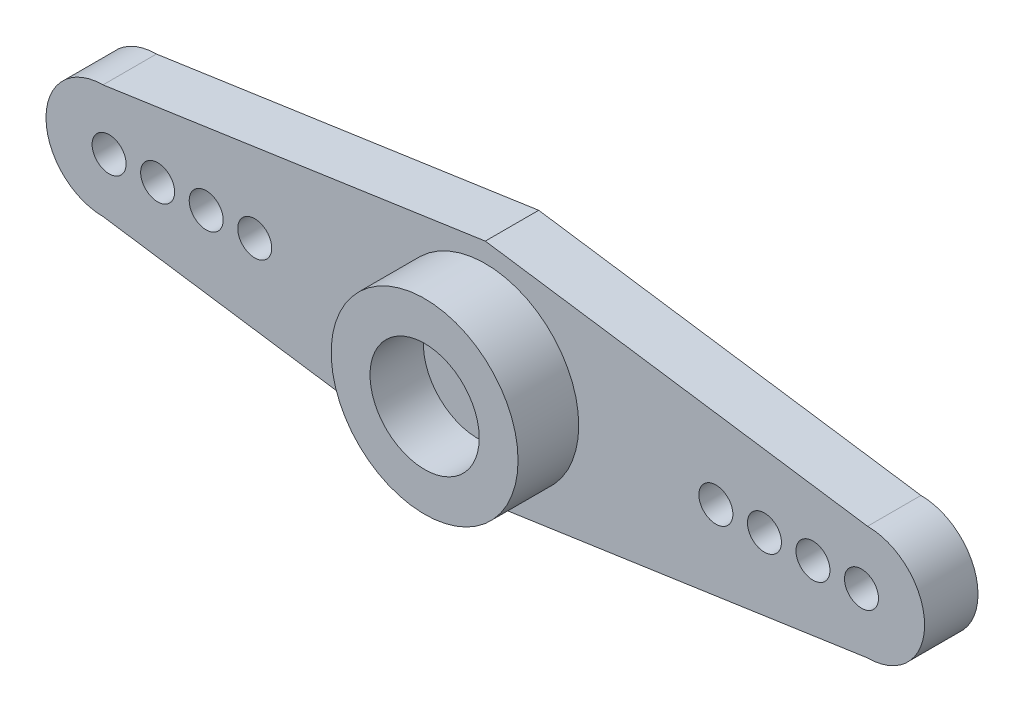
ISO-10303-21;
HEADER;
FILE_DESCRIPTION(('STEP AP214'),'2;1');
FILE_NAME('part.step','',(''),(''),'','','');
FILE_SCHEMA(('AUTOMOTIVE_DESIGN { 1 0 10303 214 1 1 1 1 }'));
ENDSEC;
DATA;
#1=APPLICATION_CONTEXT('core data for automotive mechanical design processes');
#2=APPLICATION_PROTOCOL_DEFINITION('international standard','automotive_design',2000,#1);
#3=PRODUCT_CONTEXT('',#1,'mechanical');
#4=PRODUCT('Part','Part','',(#3));
#5=PRODUCT_RELATED_PRODUCT_CATEGORY('part','',(#4));
#6=PRODUCT_DEFINITION_FORMATION('','',#4);
#7=PRODUCT_DEFINITION_CONTEXT('part definition',#1,'design');
#8=PRODUCT_DEFINITION('design','',#6,#7);
#9=PRODUCT_DEFINITION_SHAPE('','',#8);
#10=(LENGTH_UNIT() NAMED_UNIT(*) SI_UNIT(.MILLI.,.METRE.));
#11=(NAMED_UNIT(*) PLANE_ANGLE_UNIT() SI_UNIT($,.RADIAN.));
#12=(NAMED_UNIT(*) SI_UNIT($,.STERADIAN.) SOLID_ANGLE_UNIT());
#13=UNCERTAINTY_MEASURE_WITH_UNIT(LENGTH_MEASURE(1.E-05),#10,'distance_accuracy_value','');
#14=(GEOMETRIC_REPRESENTATION_CONTEXT(3) GLOBAL_UNCERTAINTY_ASSIGNED_CONTEXT((#13)) GLOBAL_UNIT_ASSIGNED_CONTEXT((#10,
#11,#12)) REPRESENTATION_CONTEXT('',''));
#15=CARTESIAN_POINT('',(0.,0.,0.));
#16=DIRECTION('',(0.,0.,1.));
#17=DIRECTION('',(1.,0.,0.));
#18=AXIS2_PLACEMENT_3D('',#15,#16,#17);
#19=CARTESIAN_POINT('',(22.987,5.9055,0.));
#20=DIRECTION('',(0.,0.,-1.));
#21=DIRECTION('',(-1.,0.,0.));
#22=AXIS2_PLACEMENT_3D('',#19,#20,#21);
#23=PLANE('',#22);
#24=CARTESIAN_POINT('',(-19.685,0.,0.));
#25=DIRECTION('',(0.,0.,-1.));
#26=DIRECTION('',(-1.,0.,0.));
#27=AXIS2_PLACEMENT_3D('',#24,#25,#26);
#28=CIRCLE('',#27,0.888999999999987);
#29=CARTESIAN_POINT('',(-20.574,0.,0.));
#30=VERTEX_POINT('',#29);
#31=EDGE_CURVE('E137',#30,#30,#28,.T.);
#32=ORIENTED_EDGE('',*,*,#31,.F.);
#33=EDGE_LOOP('',(#32));
#34=FACE_BOUND('',#33,.T.);
#35=CARTESIAN_POINT('',(-17.145,0.,0.));
#36=DIRECTION('',(0.,0.,-1.));
#37=DIRECTION('',(-1.,0.,0.));
#38=AXIS2_PLACEMENT_3D('',#35,#36,#37);
#39=CIRCLE('',#38,0.888999999999987);
#40=CARTESIAN_POINT('',(-18.034,0.,0.));
#41=VERTEX_POINT('',#40);
#42=EDGE_CURVE('E141',#41,#41,#39,.T.);
#43=ORIENTED_EDGE('',*,*,#42,.F.);
#44=EDGE_LOOP('',(#43));
#45=FACE_BOUND('',#44,.T.);
#46=CARTESIAN_POINT('',(-14.605,0.,0.));
#47=DIRECTION('',(0.,0.,-1.));
#48=DIRECTION('',(-1.,0.,0.));
#49=AXIS2_PLACEMENT_3D('',#46,#47,#48);
#50=CIRCLE('',#49,0.888999999999989);
#51=CARTESIAN_POINT('',(-15.494,0.,0.));
#52=VERTEX_POINT('',#51);
#53=EDGE_CURVE('E145',#52,#52,#50,.T.);
#54=ORIENTED_EDGE('',*,*,#53,.F.);
#55=EDGE_LOOP('',(#54));
#56=FACE_BOUND('',#55,.T.);
#57=CARTESIAN_POINT('',(-12.065,0.,0.));
#58=DIRECTION('',(0.,0.,-1.));
#59=DIRECTION('',(-1.,0.,0.));
#60=AXIS2_PLACEMENT_3D('',#57,#58,#59);
#61=CIRCLE('',#60,0.888999999999989);
#62=CARTESIAN_POINT('',(-12.954,0.,0.));
#63=VERTEX_POINT('',#62);
#64=EDGE_CURVE('E149',#63,#63,#61,.T.);
#65=ORIENTED_EDGE('',*,*,#64,.F.);
#66=EDGE_LOOP('',(#65));
#67=FACE_BOUND('',#66,.T.);
#68=CARTESIAN_POINT('',(19.685,0.,0.));
#69=DIRECTION('',(0.,0.,-1.));
#70=DIRECTION('',(-1.,0.,0.));
#71=AXIS2_PLACEMENT_3D('',#68,#69,#70);
#72=CIRCLE('',#71,0.888999999999987);
#73=CARTESIAN_POINT('',(18.796,0.,0.));
#74=VERTEX_POINT('',#73);
#75=EDGE_CURVE('E153',#74,#74,#72,.T.);
#76=ORIENTED_EDGE('',*,*,#75,.F.);
#77=EDGE_LOOP('',(#76));
#78=FACE_BOUND('',#77,.T.);
#79=CARTESIAN_POINT('',(17.145,0.,0.));
#80=DIRECTION('',(0.,0.,-1.));
#81=DIRECTION('',(-1.,0.,0.));
#82=AXIS2_PLACEMENT_3D('',#79,#80,#81);
#83=CIRCLE('',#82,0.888999999999987);
#84=CARTESIAN_POINT('',(16.256,0.,0.));
#85=VERTEX_POINT('',#84);
#86=EDGE_CURVE('E158',#85,#85,#83,.T.);
#87=ORIENTED_EDGE('',*,*,#86,.F.);
#88=EDGE_LOOP('',(#87));
#89=FACE_BOUND('',#88,.T.);
#90=CARTESIAN_POINT('',(14.605,0.,0.));
#91=DIRECTION('',(0.,0.,-1.));
#92=DIRECTION('',(-1.,0.,0.));
#93=AXIS2_PLACEMENT_3D('',#90,#91,#92);
#94=CIRCLE('',#93,0.888999999999989);
#95=CARTESIAN_POINT('',(13.716,0.,0.));
#96=VERTEX_POINT('',#95);
#97=EDGE_CURVE('E163',#96,#96,#94,.T.);
#98=ORIENTED_EDGE('',*,*,#97,.F.);
#99=EDGE_LOOP('',(#98));
#100=FACE_BOUND('',#99,.T.);
#101=CARTESIAN_POINT('',(12.065,0.,0.));
#102=DIRECTION('',(0.,0.,-1.));
#103=DIRECTION('',(-1.,0.,0.));
#104=AXIS2_PLACEMENT_3D('',#101,#102,#103);
#105=CIRCLE('',#104,0.888999999999989);
#106=CARTESIAN_POINT('',(11.176,0.,0.));
#107=VERTEX_POINT('',#106);
#108=EDGE_CURVE('E168',#107,#107,#105,.T.);
#109=ORIENTED_EDGE('',*,*,#108,.F.);
#110=EDGE_LOOP('',(#109));
#111=FACE_BOUND('',#110,.T.);
#112=CARTESIAN_POINT('',(20.0025,0.,0.));
#113=DIRECTION('',(0.,0.,1.));
#114=DIRECTION('',(-1.,0.,0.));
#115=AXIS2_PLACEMENT_3D('',#112,#113,#114);
#116=CIRCLE('',#115,2.9845);
#117=CARTESIAN_POINT('',(20.0025,-2.9845,0.));
#118=VERTEX_POINT('',#117);
#119=CARTESIAN_POINT('',(20.0025,2.9845,0.));
#120=VERTEX_POINT('',#119);
#121=EDGE_CURVE('E59',#118,#120,#116,.T.);
#122=ORIENTED_EDGE('',*,*,#121,.F.);
#123=DIRECTION('',(0.9895049271173,0.144499132213955,0.));
#124=VECTOR('',#123,1.);
#125=CARTESIAN_POINT('',(20.0025,-2.9845,0.));
#126=LINE('',#125,#124);
#127=CARTESIAN_POINT('',(-1.48999871685609E-13,-5.90549999999999,0.));
#128=VERTEX_POINT('',#127);
#129=EDGE_CURVE('E118',#128,#118,#126,.T.);
#130=ORIENTED_EDGE('',*,*,#129,.F.);
#131=DIRECTION('',(-0.9895049271173,0.144499132213955,0.));
#132=VECTOR('',#131,1.);
#133=CARTESIAN_POINT('',(-20.0025,-2.9845,0.));
#134=LINE('',#133,#132);
#135=CARTESIAN_POINT('',(-20.0025,-2.9845,0.));
#136=VERTEX_POINT('',#135);
#137=EDGE_CURVE('E131',#128,#136,#134,.T.);
#138=ORIENTED_EDGE('',*,*,#137,.T.);
#139=CARTESIAN_POINT('',(-20.0025,0.,0.));
#140=DIRECTION('',(0.,0.,-1.));
#141=DIRECTION('',(1.,0.,0.));
#142=AXIS2_PLACEMENT_3D('',#139,#140,#141);
#143=CIRCLE('',#142,2.9845);
#144=CARTESIAN_POINT('',(-20.0025,2.9845,0.));
#145=VERTEX_POINT('',#144);
#146=EDGE_CURVE('E126',#136,#145,#143,.T.);
#147=ORIENTED_EDGE('',*,*,#146,.T.);
#148=DIRECTION('',(0.9895049271173,0.144499132213955,0.));
#149=VECTOR('',#148,1.);
#150=CARTESIAN_POINT('',(-20.0025,2.9845,0.));
#151=LINE('',#150,#149);
#152=CARTESIAN_POINT('',(0.,5.90549999999999,0.));
#153=VERTEX_POINT('',#152);
#154=EDGE_CURVE('E123',#145,#153,#151,.T.);
#155=ORIENTED_EDGE('',*,*,#154,.T.);
#156=DIRECTION('',(-0.9895049271173,0.144499132213955,0.));
#157=VECTOR('',#156,1.);
#158=CARTESIAN_POINT('',(20.0025,2.9845,0.));
#159=LINE('',#158,#157);
#160=EDGE_CURVE('E121',#120,#153,#159,.T.);
#161=ORIENTED_EDGE('',*,*,#160,.F.);
#162=EDGE_LOOP('',(#122,#130,#138,#147,#155,#161));
#163=FACE_BOUND('',#162,.T.);
#164=ADVANCED_FACE('F42',(#34,#45,#56,#67,#78,#89,#100,#111,#163),#23,.T.);
#165=CARTESIAN_POINT('',(0.,0.,2.794));
#166=DIRECTION('',(0.,0.,1.));
#167=DIRECTION('',(1.,0.,0.));
#168=AXIS2_PLACEMENT_3D('',#165,#166,#167);
#169=PLANE('',#168);
#170=CARTESIAN_POINT('',(-19.685,0.,2.794));
#171=DIRECTION('',(0.,0.,1.));
#172=DIRECTION('',(1.,0.,0.));
#173=AXIS2_PLACEMENT_3D('',#170,#171,#172);
#174=CIRCLE('',#173,0.888999999999987);
#175=CARTESIAN_POINT('',(-18.796,0.,2.794));
#176=VERTEX_POINT('',#175);
#177=EDGE_CURVE('E140',#176,#176,#174,.T.);
#178=ORIENTED_EDGE('',*,*,#177,.F.);
#179=EDGE_LOOP('',(#178));
#180=FACE_BOUND('',#179,.T.);
#181=CARTESIAN_POINT('',(-17.145,0.,2.794));
#182=DIRECTION('',(0.,0.,1.));
#183=DIRECTION('',(1.,0.,0.));
#184=AXIS2_PLACEMENT_3D('',#181,#182,#183);
#185=CIRCLE('',#184,0.888999999999987);
#186=CARTESIAN_POINT('',(-16.256,0.,2.794));
#187=VERTEX_POINT('',#186);
#188=EDGE_CURVE('E144',#187,#187,#185,.T.);
#189=ORIENTED_EDGE('',*,*,#188,.F.);
#190=EDGE_LOOP('',(#189));
#191=FACE_BOUND('',#190,.T.);
#192=CARTESIAN_POINT('',(-14.605,0.,2.794));
#193=DIRECTION('',(0.,0.,1.));
#194=DIRECTION('',(1.,0.,0.));
#195=AXIS2_PLACEMENT_3D('',#192,#193,#194);
#196=CIRCLE('',#195,0.888999999999988);
#197=CARTESIAN_POINT('',(-13.716,0.,2.794));
#198=VERTEX_POINT('',#197);
#199=EDGE_CURVE('E148',#198,#198,#196,.T.);
#200=ORIENTED_EDGE('',*,*,#199,.F.);
#201=EDGE_LOOP('',(#200));
#202=FACE_BOUND('',#201,.T.);
#203=CARTESIAN_POINT('',(-12.065,0.,2.794));
#204=DIRECTION('',(0.,0.,1.));
#205=DIRECTION('',(1.,0.,0.));
#206=AXIS2_PLACEMENT_3D('',#203,#204,#205);
#207=CIRCLE('',#206,0.888999999999988);
#208=CARTESIAN_POINT('',(-11.176,0.,2.794));
#209=VERTEX_POINT('',#208);
#210=EDGE_CURVE('E152',#209,#209,#207,.T.);
#211=ORIENTED_EDGE('',*,*,#210,.F.);
#212=EDGE_LOOP('',(#211));
#213=FACE_BOUND('',#212,.T.);
#214=CARTESIAN_POINT('',(19.685,0.,2.794));
#215=DIRECTION('',(0.,0.,1.));
#216=DIRECTION('',(1.,0.,0.));
#217=AXIS2_PLACEMENT_3D('',#214,#215,#216);
#218=CIRCLE('',#217,0.888999999999987);
#219=CARTESIAN_POINT('',(20.574,0.,2.794));
#220=VERTEX_POINT('',#219);
#221=EDGE_CURVE('E157',#220,#220,#218,.T.);
#222=ORIENTED_EDGE('',*,*,#221,.F.);
#223=EDGE_LOOP('',(#222));
#224=FACE_BOUND('',#223,.T.);
#225=CARTESIAN_POINT('',(17.145,0.,2.794));
#226=DIRECTION('',(0.,0.,1.));
#227=DIRECTION('',(1.,0.,0.));
#228=AXIS2_PLACEMENT_3D('',#225,#226,#227);
#229=CIRCLE('',#228,0.888999999999987);
#230=CARTESIAN_POINT('',(18.034,0.,2.794));
#231=VERTEX_POINT('',#230);
#232=EDGE_CURVE('E162',#231,#231,#229,.T.);
#233=ORIENTED_EDGE('',*,*,#232,.F.);
#234=EDGE_LOOP('',(#233));
#235=FACE_BOUND('',#234,.T.);
#236=CARTESIAN_POINT('',(14.605,0.,2.794));
#237=DIRECTION('',(0.,0.,1.));
#238=DIRECTION('',(1.,0.,0.));
#239=AXIS2_PLACEMENT_3D('',#236,#237,#238);
#240=CIRCLE('',#239,0.888999999999988);
#241=CARTESIAN_POINT('',(15.494,0.,2.794));
#242=VERTEX_POINT('',#241);
#243=EDGE_CURVE('E167',#242,#242,#240,.T.);
#244=ORIENTED_EDGE('',*,*,#243,.F.);
#245=EDGE_LOOP('',(#244));
#246=FACE_BOUND('',#245,.T.);
#247=CARTESIAN_POINT('',(12.065,0.,2.794));
#248=DIRECTION('',(0.,0.,1.));
#249=DIRECTION('',(1.,0.,0.));
#250=AXIS2_PLACEMENT_3D('',#247,#248,#249);
#251=CIRCLE('',#250,0.888999999999988);
#252=CARTESIAN_POINT('',(12.954,0.,2.794));
#253=VERTEX_POINT('',#252);
#254=EDGE_CURVE('E172',#253,#253,#251,.T.);
#255=ORIENTED_EDGE('',*,*,#254,.F.);
#256=EDGE_LOOP('',(#255));
#257=FACE_BOUND('',#256,.T.);
#258=CARTESIAN_POINT('',(0.,0.,2.794));
#259=DIRECTION('',(0.,0.,1.));
#260=DIRECTION('',(1.,0.,0.));
#261=AXIS2_PLACEMENT_3D('',#258,#259,#260);
#262=CIRCLE('',#261,4.8895);
#263=CARTESIAN_POINT('',(4.8895,0.,2.794));
#264=VERTEX_POINT('',#263);
#265=EDGE_CURVE('E108',#264,#264,#262,.T.);
#266=ORIENTED_EDGE('',*,*,#265,.F.);
#267=EDGE_LOOP('',(#266));
#268=FACE_BOUND('',#267,.T.);
#269=DIRECTION('',(-0.9895049271173,0.144499132213955,0.));
#270=VECTOR('',#269,1.);
#271=CARTESIAN_POINT('',(-0.844383763728395,-5.78219316466189,2.794));
#272=LINE('',#271,#270);
#273=CARTESIAN_POINT('',(-1.52993049696762E-13,-5.90549999999999,2.794));
#274=VERTEX_POINT('',#273);
#275=CARTESIAN_POINT('',(-20.0025,-2.9845,2.794));
#276=VERTEX_POINT('',#275);
#277=EDGE_CURVE('E50',#274,#276,#272,.T.);
#278=ORIENTED_EDGE('',*,*,#277,.F.);
#279=DIRECTION('',(0.9895049271173,0.144499132213955,0.));
#280=VECTOR('',#279,1.);
#281=CARTESIAN_POINT('',(0.844383763728409,-5.78219316466188,2.794));
#282=LINE('',#281,#280);
#283=CARTESIAN_POINT('',(20.0025,-2.9845,2.794));
#284=VERTEX_POINT('',#283);
#285=EDGE_CURVE('E117',#274,#284,#282,.T.);
#286=ORIENTED_EDGE('',*,*,#285,.T.);
#287=CARTESIAN_POINT('',(20.0025,0.,2.794));
#288=DIRECTION('',(0.,0.,1.));
#289=DIRECTION('',(1.,0.,0.));
#290=AXIS2_PLACEMENT_3D('',#287,#288,#289);
#291=CIRCLE('',#290,2.9845);
#292=CARTESIAN_POINT('',(20.0025,2.9845,2.794));
#293=VERTEX_POINT('',#292);
#294=EDGE_CURVE('E12',#284,#293,#291,.T.);
#295=ORIENTED_EDGE('',*,*,#294,.T.);
#296=DIRECTION('',(-0.9895049271173,0.144499132213955,0.));
#297=VECTOR('',#296,1.);
#298=CARTESIAN_POINT('',(0.844383763728408,5.78219316466188,2.794));
#299=LINE('',#298,#297);
#300=CARTESIAN_POINT('',(0.,5.9055,2.794));
#301=VERTEX_POINT('',#300);
#302=EDGE_CURVE('E111',#293,#301,#299,.T.);
#303=ORIENTED_EDGE('',*,*,#302,.T.);
#304=DIRECTION('',(0.9895049271173,0.144499132213955,0.));
#305=VECTOR('',#304,1.);
#306=CARTESIAN_POINT('',(-0.844383763728395,5.78219316466188,2.794));
#307=LINE('',#306,#305);
#308=CARTESIAN_POINT('',(-20.0025,2.9845,2.794));
#309=VERTEX_POINT('',#308);
#310=EDGE_CURVE('E96',#309,#301,#307,.T.);
#311=ORIENTED_EDGE('',*,*,#310,.F.);
#312=CARTESIAN_POINT('',(-20.0025,0.,2.794));
#313=DIRECTION('',(0.,0.,1.));
#314=DIRECTION('',(1.,0.,0.));
#315=AXIS2_PLACEMENT_3D('',#312,#313,#314);
#316=CIRCLE('',#315,2.9845);
#317=EDGE_CURVE('E107',#276,#309,#316,.F.);
#318=ORIENTED_EDGE('',*,*,#317,.F.);
#319=EDGE_LOOP('',(#278,#286,#295,#303,#311,#318));
#320=FACE_BOUND('',#319,.T.);
#321=ADVANCED_FACE('F112',(#180,#191,#202,#213,#224,#235,#246,#257,#268,#320),#169,.T.);
#322=CARTESIAN_POINT('',(0.,0.,2.794));
#323=DIRECTION('',(0.,0.,1.));
#324=DIRECTION('',(1.,0.,0.));
#325=AXIS2_PLACEMENT_3D('',#322,#323,#324);
#326=CYLINDRICAL_SURFACE('',#325,4.8895);
#327=ORIENTED_EDGE('',*,*,#265,.T.);
#328=EDGE_LOOP('',(#327));
#329=FACE_BOUND('',#328,.T.);
#330=CARTESIAN_POINT('',(0.,0.,5.969));
#331=DIRECTION('',(0.,0.,1.));
#332=DIRECTION('',(1.,0.,0.));
#333=AXIS2_PLACEMENT_3D('',#330,#331,#332);
#334=CIRCLE('',#333,4.8895);
#335=CARTESIAN_POINT('',(4.8895,0.,5.969));
#336=VERTEX_POINT('',#335);
#337=EDGE_CURVE('E176',#336,#336,#334,.T.);
#338=ORIENTED_EDGE('',*,*,#337,.F.);
#339=EDGE_LOOP('',(#338));
#340=FACE_BOUND('',#339,.T.);
#341=ADVANCED_FACE('F237',(#329,#340),#326,.T.);
#342=CARTESIAN_POINT('',(22.987,5.9055,5.969));
#343=DIRECTION('',(0.,0.,-1.));
#344=DIRECTION('',(-1.,0.,0.));
#345=AXIS2_PLACEMENT_3D('',#342,#343,#344);
#346=PLANE('',#345);
#347=CARTESIAN_POINT('',(0.,0.,5.969));
#348=DIRECTION('',(0.,0.,1.));
#349=DIRECTION('',(1.,0.,0.));
#350=AXIS2_PLACEMENT_3D('',#347,#348,#349);
#351=CIRCLE('',#350,2.8575);
#352=CARTESIAN_POINT('',(2.8575,0.,5.969));
#353=VERTEX_POINT('',#352);
#354=EDGE_CURVE('E177',#353,#353,#351,.T.);
#355=ORIENTED_EDGE('',*,*,#354,.F.);
#356=EDGE_LOOP('',(#355));
#357=FACE_BOUND('',#356,.T.);
#358=ORIENTED_EDGE('',*,*,#337,.T.);
#359=EDGE_LOOP('',(#358));
#360=FACE_BOUND('',#359,.T.);
#361=ADVANCED_FACE('F276',(#357,#360),#346,.F.);
#362=CARTESIAN_POINT('',(0.,0.,3.175));
#363=DIRECTION('',(0.,0.,1.));
#364=DIRECTION('',(1.,0.,0.));
#365=AXIS2_PLACEMENT_3D('',#362,#363,#364);
#366=CYLINDRICAL_SURFACE('',#365,2.8575);
#367=CARTESIAN_POINT('',(0.,0.,3.175));
#368=DIRECTION('',(0.,0.,1.));
#369=DIRECTION('',(1.,0.,0.));
#370=AXIS2_PLACEMENT_3D('',#367,#368,#369);
#371=CIRCLE('',#370,2.8575);
#372=CARTESIAN_POINT('',(2.8575,0.,3.175));
#373=VERTEX_POINT('',#372);
#374=EDGE_CURVE('E173',#373,#373,#371,.T.);
#375=ORIENTED_EDGE('',*,*,#374,.F.);
#376=EDGE_LOOP('',(#375));
#377=FACE_BOUND('',#376,.T.);
#378=ORIENTED_EDGE('',*,*,#354,.T.);
#379=EDGE_LOOP('',(#378));
#380=FACE_BOUND('',#379,.T.);
#381=ADVANCED_FACE('F269',(#377,#380),#366,.F.);
#382=CARTESIAN_POINT('',(0.,0.,3.175));
#383=DIRECTION('',(0.,0.,1.));
#384=DIRECTION('',(1.,0.,0.));
#385=AXIS2_PLACEMENT_3D('',#382,#383,#384);
#386=PLANE('',#385);
#387=ORIENTED_EDGE('',*,*,#374,.T.);
#388=EDGE_LOOP('',(#387));
#389=FACE_BOUND('',#388,.T.);
#390=ADVANCED_FACE('F259',(#389),#386,.T.);
#391=CARTESIAN_POINT('',(12.065,0.,0.));
#392=DIRECTION('',(0.,0.,-1.));
#393=DIRECTION('',(-1.,0.,0.));
#394=AXIS2_PLACEMENT_3D('',#391,#392,#393);
#395=CYLINDRICAL_SURFACE('',#394,0.888999999999988);
#396=ORIENTED_EDGE('',*,*,#254,.T.);
#397=EDGE_LOOP('',(#396));
#398=FACE_BOUND('',#397,.T.);
#399=ORIENTED_EDGE('',*,*,#108,.T.);
#400=EDGE_LOOP('',(#399));
#401=FACE_BOUND('',#400,.T.);
#402=ADVANCED_FACE('F256',(#398,#401),#395,.F.);
#403=CARTESIAN_POINT('',(14.605,0.,0.));
#404=DIRECTION('',(0.,0.,-1.));
#405=DIRECTION('',(-1.,0.,0.));
#406=AXIS2_PLACEMENT_3D('',#403,#404,#405);
#407=CYLINDRICAL_SURFACE('',#406,0.888999999999988);
#408=ORIENTED_EDGE('',*,*,#243,.T.);
#409=EDGE_LOOP('',(#408));
#410=FACE_BOUND('',#409,.T.);
#411=ORIENTED_EDGE('',*,*,#97,.T.);
#412=EDGE_LOOP('',(#411));
#413=FACE_BOUND('',#412,.T.);
#414=ADVANCED_FACE('F258',(#410,#413),#407,.F.);
#415=CARTESIAN_POINT('',(17.145,0.,0.));
#416=DIRECTION('',(0.,0.,-1.));
#417=DIRECTION('',(-1.,0.,0.));
#418=AXIS2_PLACEMENT_3D('',#415,#416,#417);
#419=CYLINDRICAL_SURFACE('',#418,0.888999999999987);
#420=ORIENTED_EDGE('',*,*,#232,.T.);
#421=EDGE_LOOP('',(#420));
#422=FACE_BOUND('',#421,.T.);
#423=ORIENTED_EDGE('',*,*,#86,.T.);
#424=EDGE_LOOP('',(#423));
#425=FACE_BOUND('',#424,.T.);
#426=ADVANCED_FACE('F266',(#422,#425),#419,.F.);
#427=CARTESIAN_POINT('',(19.685,0.,0.));
#428=DIRECTION('',(0.,0.,-1.));
#429=DIRECTION('',(-1.,0.,0.));
#430=AXIS2_PLACEMENT_3D('',#427,#428,#429);
#431=CYLINDRICAL_SURFACE('',#430,0.888999999999987);
#432=ORIENTED_EDGE('',*,*,#221,.T.);
#433=EDGE_LOOP('',(#432));
#434=FACE_BOUND('',#433,.T.);
#435=ORIENTED_EDGE('',*,*,#75,.T.);
#436=EDGE_LOOP('',(#435));
#437=FACE_BOUND('',#436,.T.);
#438=ADVANCED_FACE('F318',(#434,#437),#431,.F.);
#439=CARTESIAN_POINT('',(-12.065,0.,0.));
#440=DIRECTION('',(0.,0.,-1.));
#441=DIRECTION('',(-1.,0.,0.));
#442=AXIS2_PLACEMENT_3D('',#439,#440,#441);
#443=CYLINDRICAL_SURFACE('',#442,0.888999999999988);
#444=ORIENTED_EDGE('',*,*,#210,.T.);
#445=EDGE_LOOP('',(#444));
#446=FACE_BOUND('',#445,.T.);
#447=ORIENTED_EDGE('',*,*,#64,.T.);
#448=EDGE_LOOP('',(#447));
#449=FACE_BOUND('',#448,.T.);
#450=ADVANCED_FACE('F327',(#446,#449),#443,.F.);
#451=CARTESIAN_POINT('',(-14.605,0.,0.));
#452=DIRECTION('',(0.,0.,-1.));
#453=DIRECTION('',(-1.,0.,0.));
#454=AXIS2_PLACEMENT_3D('',#451,#452,#453);
#455=CYLINDRICAL_SURFACE('',#454,0.888999999999988);
#456=ORIENTED_EDGE('',*,*,#199,.T.);
#457=EDGE_LOOP('',(#456));
#458=FACE_BOUND('',#457,.T.);
#459=ORIENTED_EDGE('',*,*,#53,.T.);
#460=EDGE_LOOP('',(#459));
#461=FACE_BOUND('',#460,.T.);
#462=ADVANCED_FACE('F337',(#458,#461),#455,.F.);
#463=CARTESIAN_POINT('',(-17.145,0.,0.));
#464=DIRECTION('',(0.,0.,-1.));
#465=DIRECTION('',(-1.,0.,0.));
#466=AXIS2_PLACEMENT_3D('',#463,#464,#465);
#467=CYLINDRICAL_SURFACE('',#466,0.888999999999987);
#468=ORIENTED_EDGE('',*,*,#188,.T.);
#469=EDGE_LOOP('',(#468));
#470=FACE_BOUND('',#469,.T.);
#471=ORIENTED_EDGE('',*,*,#42,.T.);
#472=EDGE_LOOP('',(#471));
#473=FACE_BOUND('',#472,.T.);
#474=ADVANCED_FACE('F347',(#470,#473),#467,.F.);
#475=CARTESIAN_POINT('',(-19.685,0.,0.));
#476=DIRECTION('',(0.,0.,-1.));
#477=DIRECTION('',(-1.,0.,0.));
#478=AXIS2_PLACEMENT_3D('',#475,#476,#477);
#479=CYLINDRICAL_SURFACE('',#478,0.888999999999987);
#480=ORIENTED_EDGE('',*,*,#177,.T.);
#481=EDGE_LOOP('',(#480));
#482=FACE_BOUND('',#481,.T.);
#483=ORIENTED_EDGE('',*,*,#31,.T.);
#484=EDGE_LOOP('',(#483));
#485=FACE_BOUND('',#484,.T.);
#486=ADVANCED_FACE('F357',(#482,#485),#479,.F.);
#487=CARTESIAN_POINT('',(-20.0025,-2.9845,0.));
#488=DIRECTION('',(0.144499132213955,0.9895049271173,0.));
#489=DIRECTION('',(-0.9895049271173,0.144499132213955,0.));
#490=AXIS2_PLACEMENT_3D('',#487,#488,#489);
#491=PLANE('',#490);
#492=DIRECTION('',(0.,0.,1.));
#493=VECTOR('',#492,1.);
#494=CARTESIAN_POINT('',(0.,-5.9055,0.));
#495=LINE('',#494,#493);
#496=EDGE_CURVE('E134',#128,#274,#495,.T.);
#497=ORIENTED_EDGE('',*,*,#496,.T.);
#498=ORIENTED_EDGE('',*,*,#277,.T.);
#499=DIRECTION('',(0.,0.,1.));
#500=VECTOR('',#499,1.);
#501=CARTESIAN_POINT('',(-20.0025,-2.9845,0.));
#502=LINE('',#501,#500);
#503=EDGE_CURVE('E122',#136,#276,#502,.T.);
#504=ORIENTED_EDGE('',*,*,#503,.F.);
#505=ORIENTED_EDGE('',*,*,#137,.F.);
#506=EDGE_LOOP('',(#497,#498,#504,#505));
#507=FACE_BOUND('',#506,.T.);
#508=ADVANCED_FACE('F207',(#507),#491,.F.);
#509=CARTESIAN_POINT('',(-20.0025,0.,0.));
#510=DIRECTION('',(0.,0.,1.));
#511=DIRECTION('',(1.,0.,0.));
#512=AXIS2_PLACEMENT_3D('',#509,#510,#511);
#513=CYLINDRICAL_SURFACE('',#512,2.9845);
#514=ORIENTED_EDGE('',*,*,#503,.T.);
#515=ORIENTED_EDGE('',*,*,#317,.T.);
#516=DIRECTION('',(0.,0.,1.));
#517=VECTOR('',#516,1.);
#518=CARTESIAN_POINT('',(-20.0025,2.9845,0.));
#519=LINE('',#518,#517);
#520=EDGE_CURVE('E104',#145,#309,#519,.T.);
#521=ORIENTED_EDGE('',*,*,#520,.F.);
#522=ORIENTED_EDGE('',*,*,#146,.F.);
#523=EDGE_LOOP('',(#514,#515,#521,#522));
#524=FACE_BOUND('',#523,.T.);
#525=ADVANCED_FACE('F213',(#524),#513,.T.);
#526=CARTESIAN_POINT('',(-20.0025,2.9845,0.));
#527=DIRECTION('',(0.144499132213955,-0.9895049271173,0.));
#528=DIRECTION('',(0.9895049271173,0.144499132213955,0.));
#529=AXIS2_PLACEMENT_3D('',#526,#527,#528);
#530=PLANE('',#529);
#531=ORIENTED_EDGE('',*,*,#520,.T.);
#532=ORIENTED_EDGE('',*,*,#310,.T.);
#533=DIRECTION('',(0.,0.,1.));
#534=VECTOR('',#533,1.);
#535=CARTESIAN_POINT('',(0.,5.9055,0.));
#536=LINE('',#535,#534);
#537=EDGE_CURVE('E101',#153,#301,#536,.T.);
#538=ORIENTED_EDGE('',*,*,#537,.F.);
#539=ORIENTED_EDGE('',*,*,#154,.F.);
#540=EDGE_LOOP('',(#531,#532,#538,#539));
#541=FACE_BOUND('',#540,.T.);
#542=ADVANCED_FACE('F98',(#541),#530,.F.);
#543=CARTESIAN_POINT('',(20.0025,-2.9845,0.));
#544=DIRECTION('',(0.144499132213955,-0.9895049271173,0.));
#545=DIRECTION('',(0.9895049271173,0.144499132213955,0.));
#546=AXIS2_PLACEMENT_3D('',#543,#544,#545);
#547=PLANE('',#546);
#548=ORIENTED_EDGE('',*,*,#285,.F.);
#549=ORIENTED_EDGE('',*,*,#496,.F.);
#550=ORIENTED_EDGE('',*,*,#129,.T.);
#551=DIRECTION('',(0.,0.,1.));
#552=VECTOR('',#551,1.);
#553=CARTESIAN_POINT('',(20.0025,-2.9845,0.));
#554=LINE('',#553,#552);
#555=EDGE_CURVE('E217',#118,#284,#554,.T.);
#556=ORIENTED_EDGE('',*,*,#555,.T.);
#557=EDGE_LOOP('',(#548,#549,#550,#556));
#558=FACE_BOUND('',#557,.T.);
#559=ADVANCED_FACE('F231',(#558),#547,.T.);
#560=CARTESIAN_POINT('',(20.0025,0.,0.));
#561=DIRECTION('',(0.,0.,1.));
#562=DIRECTION('',(1.,0.,0.));
#563=AXIS2_PLACEMENT_3D('',#560,#561,#562);
#564=CYLINDRICAL_SURFACE('',#563,2.9845);
#565=ORIENTED_EDGE('',*,*,#294,.F.);
#566=ORIENTED_EDGE('',*,*,#555,.F.);
#567=ORIENTED_EDGE('',*,*,#121,.T.);
#568=DIRECTION('',(0.,0.,1.));
#569=VECTOR('',#568,1.);
#570=CARTESIAN_POINT('',(20.0025,2.9845,0.));
#571=LINE('',#570,#569);
#572=EDGE_CURVE('E221',#120,#293,#571,.T.);
#573=ORIENTED_EDGE('',*,*,#572,.T.);
#574=EDGE_LOOP('',(#565,#566,#567,#573));
#575=FACE_BOUND('',#574,.T.);
#576=ADVANCED_FACE('F411',(#575),#564,.T.);
#577=CARTESIAN_POINT('',(20.0025,2.9845,0.));
#578=DIRECTION('',(0.144499132213955,0.9895049271173,0.));
#579=DIRECTION('',(-0.9895049271173,0.144499132213955,0.));
#580=AXIS2_PLACEMENT_3D('',#577,#578,#579);
#581=PLANE('',#580);
#582=ORIENTED_EDGE('',*,*,#302,.F.);
#583=ORIENTED_EDGE('',*,*,#572,.F.);
#584=ORIENTED_EDGE('',*,*,#160,.T.);
#585=ORIENTED_EDGE('',*,*,#537,.T.);
#586=EDGE_LOOP('',(#582,#583,#584,#585));
#587=FACE_BOUND('',#586,.T.);
#588=ADVANCED_FACE('F120',(#587),#581,.T.);
#589=CLOSED_SHELL('',(#164,#321,#341,#361,#381,#390,#402,#414,#426,#438,#450,#462,#474,#486,
#508,#525,#542,#559,#576,#588));
#590=MANIFOLD_SOLID_BREP('B2',#589);
#591=ADVANCED_BREP_SHAPE_REPRESENTATION('',(#18,#590),#14);
#592=SHAPE_DEFINITION_REPRESENTATION(#9,#591);
ENDSEC;
END-ISO-10303-21;
